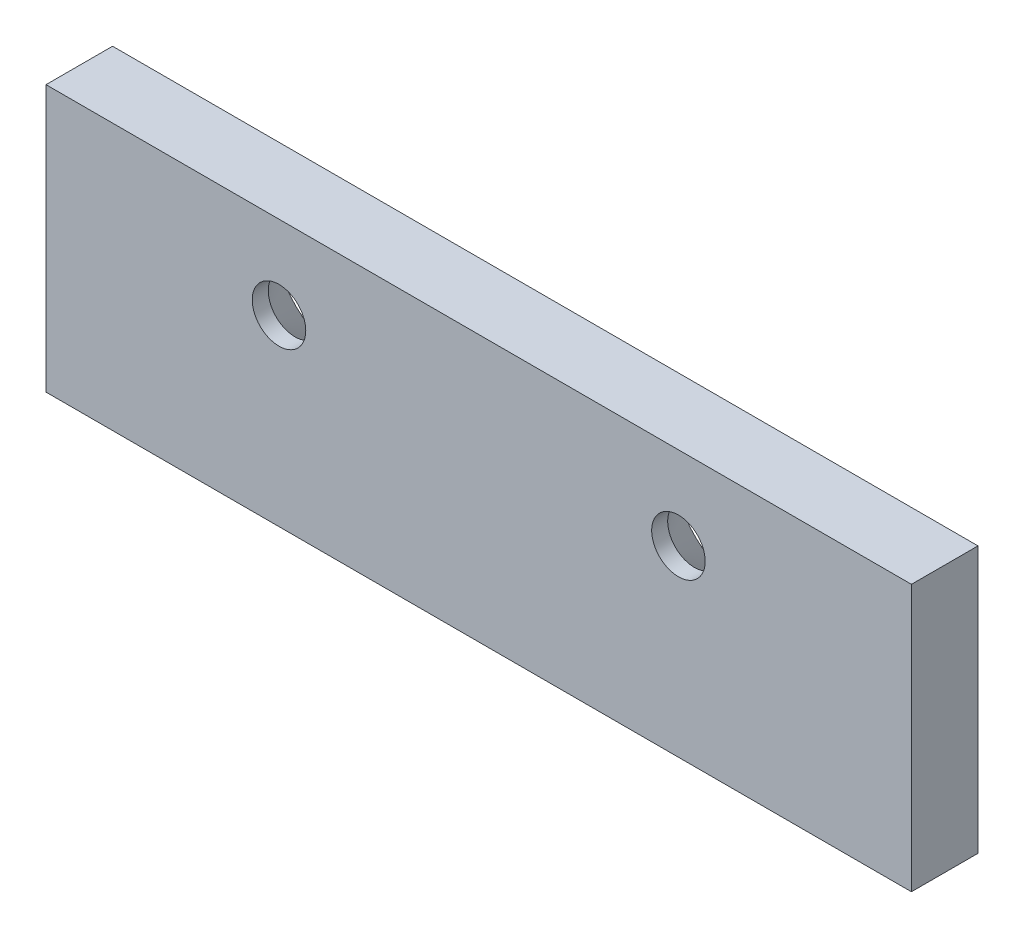
ISO-10303-21;
HEADER;
FILE_DESCRIPTION(('STEP AP214'),'2;1');
FILE_NAME('part.step','',(''),(''),'','','');
FILE_SCHEMA(('AUTOMOTIVE_DESIGN { 1 0 10303 214 1 1 1 1 }'));
ENDSEC;
DATA;
#1=APPLICATION_CONTEXT('core data for automotive mechanical design processes');
#2=APPLICATION_PROTOCOL_DEFINITION('international standard','automotive_design',2000,#1);
#3=PRODUCT_CONTEXT('',#1,'mechanical');
#4=PRODUCT('Part','Part','',(#3));
#5=PRODUCT_RELATED_PRODUCT_CATEGORY('part','',(#4));
#6=PRODUCT_DEFINITION_FORMATION('','',#4);
#7=PRODUCT_DEFINITION_CONTEXT('part definition',#1,'design');
#8=PRODUCT_DEFINITION('design','',#6,#7);
#9=PRODUCT_DEFINITION_SHAPE('','',#8);
#10=(LENGTH_UNIT() NAMED_UNIT(*) SI_UNIT(.MILLI.,.METRE.));
#11=(NAMED_UNIT(*) PLANE_ANGLE_UNIT() SI_UNIT($,.RADIAN.));
#12=(NAMED_UNIT(*) SI_UNIT($,.STERADIAN.) SOLID_ANGLE_UNIT());
#13=UNCERTAINTY_MEASURE_WITH_UNIT(LENGTH_MEASURE(1.E-05),#10,'distance_accuracy_value','');
#14=(GEOMETRIC_REPRESENTATION_CONTEXT(3) GLOBAL_UNCERTAINTY_ASSIGNED_CONTEXT((#13)) GLOBAL_UNIT_ASSIGNED_CONTEXT((#10,
#11,#12)) REPRESENTATION_CONTEXT('',''));
#15=CARTESIAN_POINT('',(0.,0.,0.));
#16=DIRECTION('',(0.,0.,1.));
#17=DIRECTION('',(1.,0.,0.));
#18=AXIS2_PLACEMENT_3D('',#15,#16,#17);
#19=CARTESIAN_POINT('',(0.,0.,-6.35));
#20=DIRECTION('',(-1.,0.,0.));
#21=DIRECTION('',(0.,0.,1.));
#22=AXIS2_PLACEMENT_3D('',#19,#20,#21);
#23=PLANE('',#22);
#24=DIRECTION('',(0.,-1.,0.));
#25=VECTOR('',#24,1.);
#26=CARTESIAN_POINT('',(0.,0.,0.));
#27=LINE('',#26,#25);
#28=CARTESIAN_POINT('',(0.,25.4,0.));
#29=VERTEX_POINT('',#28);
#30=CARTESIAN_POINT('',(0.,0.,0.));
#31=VERTEX_POINT('',#30);
#32=EDGE_CURVE('E101',#29,#31,#27,.T.);
#33=ORIENTED_EDGE('',*,*,#32,.F.);
#34=DIRECTION('',(0.,0.,1.));
#35=VECTOR('',#34,1.);
#36=CARTESIAN_POINT('',(0.,25.4,-6.35));
#37=LINE('',#36,#35);
#38=CARTESIAN_POINT('',(0.,25.4,-6.35));
#39=VERTEX_POINT('',#38);
#40=EDGE_CURVE('E11',#39,#29,#37,.T.);
#41=ORIENTED_EDGE('',*,*,#40,.F.);
#42=DIRECTION('',(0.,-1.,0.));
#43=VECTOR('',#42,1.);
#44=CARTESIAN_POINT('',(0.,0.,-6.35));
#45=LINE('',#44,#43);
#46=CARTESIAN_POINT('',(0.,0.,-6.35));
#47=VERTEX_POINT('',#46);
#48=EDGE_CURVE('E94',#39,#47,#45,.T.);
#49=ORIENTED_EDGE('',*,*,#48,.T.);
#50=DIRECTION('',(0.,0.,1.));
#51=VECTOR('',#50,1.);
#52=CARTESIAN_POINT('',(0.,0.,-6.35));
#53=LINE('',#52,#51);
#54=EDGE_CURVE('E39',#47,#31,#53,.T.);
#55=ORIENTED_EDGE('',*,*,#54,.T.);
#56=EDGE_LOOP('',(#33,#41,#49,#55));
#57=FACE_BOUND('',#56,.T.);
#58=ADVANCED_FACE('F36',(#57),#23,.T.);
#59=CARTESIAN_POINT('',(0.,25.4,-6.35));
#60=DIRECTION('',(0.,1.,0.));
#61=DIRECTION('',(0.,0.,1.));
#62=AXIS2_PLACEMENT_3D('',#59,#60,#61);
#63=PLANE('',#62);
#64=DIRECTION('',(-1.,0.,0.));
#65=VECTOR('',#64,1.);
#66=CARTESIAN_POINT('',(0.,25.4,0.));
#67=LINE('',#66,#65);
#68=CARTESIAN_POINT('',(82.55,25.4,0.));
#69=VERTEX_POINT('',#68);
#70=EDGE_CURVE('E96',#69,#29,#67,.T.);
#71=ORIENTED_EDGE('',*,*,#70,.F.);
#72=DIRECTION('',(0.,0.,1.));
#73=VECTOR('',#72,1.);
#74=CARTESIAN_POINT('',(82.55,25.4,-6.35));
#75=LINE('',#74,#73);
#76=CARTESIAN_POINT('',(82.55,25.4,-6.35));
#77=VERTEX_POINT('',#76);
#78=EDGE_CURVE('E45',#77,#69,#75,.T.);
#79=ORIENTED_EDGE('',*,*,#78,.F.);
#80=DIRECTION('',(-1.,0.,0.));
#81=VECTOR('',#80,1.);
#82=CARTESIAN_POINT('',(0.,25.4,-6.35));
#83=LINE('',#82,#81);
#84=EDGE_CURVE('E91',#77,#39,#83,.T.);
#85=ORIENTED_EDGE('',*,*,#84,.T.);
#86=ORIENTED_EDGE('',*,*,#40,.T.);
#87=EDGE_LOOP('',(#71,#79,#85,#86));
#88=FACE_BOUND('',#87,.T.);
#89=ADVANCED_FACE('F112',(#88),#63,.T.);
#90=CARTESIAN_POINT('',(82.55,0.,-6.35));
#91=DIRECTION('',(1.,0.,0.));
#92=DIRECTION('',(0.,0.,-1.));
#93=AXIS2_PLACEMENT_3D('',#90,#91,#92);
#94=PLANE('',#93);
#95=DIRECTION('',(0.,1.,0.));
#96=VECTOR('',#95,1.);
#97=CARTESIAN_POINT('',(82.55,0.,0.));
#98=LINE('',#97,#96);
#99=CARTESIAN_POINT('',(82.55,0.,0.));
#100=VERTEX_POINT('',#99);
#101=EDGE_CURVE('E86',#100,#69,#98,.T.);
#102=ORIENTED_EDGE('',*,*,#101,.F.);
#103=DIRECTION('',(0.,0.,1.));
#104=VECTOR('',#103,1.);
#105=CARTESIAN_POINT('',(82.55,0.,-6.35));
#106=LINE('',#105,#104);
#107=CARTESIAN_POINT('',(82.55,0.,-6.35));
#108=VERTEX_POINT('',#107);
#109=EDGE_CURVE('E81',#108,#100,#106,.T.);
#110=ORIENTED_EDGE('',*,*,#109,.F.);
#111=DIRECTION('',(0.,1.,0.));
#112=VECTOR('',#111,1.);
#113=CARTESIAN_POINT('',(82.55,0.,-6.35));
#114=LINE('',#113,#112);
#115=EDGE_CURVE('E84',#108,#77,#114,.T.);
#116=ORIENTED_EDGE('',*,*,#115,.T.);
#117=ORIENTED_EDGE('',*,*,#78,.T.);
#118=EDGE_LOOP('',(#102,#110,#116,#117));
#119=FACE_BOUND('',#118,.T.);
#120=ADVANCED_FACE('F83',(#119),#94,.T.);
#121=CARTESIAN_POINT('',(0.,0.,-6.35));
#122=DIRECTION('',(0.,-1.,0.));
#123=DIRECTION('',(0.,0.,-1.));
#124=AXIS2_PLACEMENT_3D('',#121,#122,#123);
#125=PLANE('',#124);
#126=DIRECTION('',(1.,0.,0.));
#127=VECTOR('',#126,1.);
#128=CARTESIAN_POINT('',(0.,0.,0.));
#129=LINE('',#128,#127);
#130=EDGE_CURVE('E104',#31,#100,#129,.T.);
#131=ORIENTED_EDGE('',*,*,#130,.F.);
#132=ORIENTED_EDGE('',*,*,#54,.F.);
#133=DIRECTION('',(1.,0.,0.));
#134=VECTOR('',#133,1.);
#135=CARTESIAN_POINT('',(0.,0.,-6.35));
#136=LINE('',#135,#134);
#137=EDGE_CURVE('E90',#47,#108,#136,.T.);
#138=ORIENTED_EDGE('',*,*,#137,.T.);
#139=ORIENTED_EDGE('',*,*,#109,.T.);
#140=EDGE_LOOP('',(#131,#132,#138,#139));
#141=FACE_BOUND('',#140,.T.);
#142=ADVANCED_FACE('F93',(#141),#125,.T.);
#143=CARTESIAN_POINT('',(0.,0.,-6.35));
#144=DIRECTION('',(0.,0.,-1.));
#145=DIRECTION('',(-1.,0.,0.));
#146=AXIS2_PLACEMENT_3D('',#143,#144,#145);
#147=PLANE('',#146);
#148=CARTESIAN_POINT('',(22.225,17.4625,-6.35));
#149=DIRECTION('',(0.,0.,1.));
#150=DIRECTION('',(1.,0.,0.));
#151=AXIS2_PLACEMENT_3D('',#148,#149,#150);
#152=CIRCLE('',#151,6.7437);
#153=CARTESIAN_POINT('',(28.9687,17.4625,-6.35));
#154=VERTEX_POINT('',#153);
#155=EDGE_CURVE('E158',#154,#154,#152,.T.);
#156=ORIENTED_EDGE('',*,*,#155,.T.);
#157=EDGE_LOOP('',(#156));
#158=FACE_BOUND('',#157,.T.);
#159=CARTESIAN_POINT('',(60.325,17.4625,-6.35));
#160=DIRECTION('',(0.,0.,1.));
#161=DIRECTION('',(1.,0.,0.));
#162=AXIS2_PLACEMENT_3D('',#159,#160,#161);
#163=CIRCLE('',#162,6.7437);
#164=CARTESIAN_POINT('',(67.0687,17.4625,-6.35));
#165=VERTEX_POINT('',#164);
#166=EDGE_CURVE('E160',#165,#165,#163,.T.);
#167=ORIENTED_EDGE('',*,*,#166,.T.);
#168=EDGE_LOOP('',(#167));
#169=FACE_BOUND('',#168,.T.);
#170=ORIENTED_EDGE('',*,*,#48,.F.);
#171=ORIENTED_EDGE('',*,*,#84,.F.);
#172=ORIENTED_EDGE('',*,*,#115,.F.);
#173=ORIENTED_EDGE('',*,*,#137,.F.);
#174=EDGE_LOOP('',(#170,#171,#172,#173));
#175=FACE_BOUND('',#174,.T.);
#176=ADVANCED_FACE('F89',(#158,#169,#175),#147,.T.);
#177=CARTESIAN_POINT('',(0.,0.,0.));
#178=DIRECTION('',(0.,0.,-1.));
#179=DIRECTION('',(-1.,0.,0.));
#180=AXIS2_PLACEMENT_3D('',#177,#178,#179);
#181=PLANE('',#180);
#182=CARTESIAN_POINT('',(22.225,17.4625,0.));
#183=DIRECTION('',(0.,0.,1.));
#184=DIRECTION('',(1.,0.,0.));
#185=AXIS2_PLACEMENT_3D('',#182,#183,#184);
#186=CIRCLE('',#185,2.55269999999999);
#187=CARTESIAN_POINT('',(24.7777,17.4625,0.));
#188=VERTEX_POINT('',#187);
#189=EDGE_CURVE('E157',#188,#188,#186,.T.);
#190=ORIENTED_EDGE('',*,*,#189,.F.);
#191=EDGE_LOOP('',(#190));
#192=FACE_BOUND('',#191,.T.);
#193=CARTESIAN_POINT('',(60.325,17.4625,0.));
#194=DIRECTION('',(0.,0.,1.));
#195=DIRECTION('',(1.,0.,0.));
#196=AXIS2_PLACEMENT_3D('',#193,#194,#195);
#197=CIRCLE('',#196,2.55269999999999);
#198=CARTESIAN_POINT('',(62.8777,17.4625,0.));
#199=VERTEX_POINT('',#198);
#200=EDGE_CURVE('E166',#199,#199,#197,.T.);
#201=ORIENTED_EDGE('',*,*,#200,.F.);
#202=EDGE_LOOP('',(#201));
#203=FACE_BOUND('',#202,.T.);
#204=ORIENTED_EDGE('',*,*,#32,.T.);
#205=ORIENTED_EDGE('',*,*,#130,.T.);
#206=ORIENTED_EDGE('',*,*,#101,.T.);
#207=ORIENTED_EDGE('',*,*,#70,.T.);
#208=EDGE_LOOP('',(#204,#205,#206,#207));
#209=FACE_BOUND('',#208,.T.);
#210=ADVANCED_FACE('F111',(#192,#203,#209),#181,.F.);
#211=CARTESIAN_POINT('',(60.325,17.4625,-1.52880600533674));
#212=DIRECTION('',(0.,0.,-1.));
#213=DIRECTION('',(-1.,0.,0.));
#214=AXIS2_PLACEMENT_3D('',#211,#212,#213);
#215=CONICAL_SURFACE('',#214,2.55270000000001,0.715584993317675);
#216=ORIENTED_EDGE('',*,*,#166,.F.);
#217=EDGE_LOOP('',(#216));
#218=FACE_BOUND('',#217,.T.);
#219=CARTESIAN_POINT('',(60.325,17.4625,-1.52880600533674));
#220=DIRECTION('',(0.,0.,1.));
#221=DIRECTION('',(1.,0.,0.));
#222=AXIS2_PLACEMENT_3D('',#219,#220,#221);
#223=CIRCLE('',#222,2.55270000000001);
#224=CARTESIAN_POINT('',(62.8777,17.4625,-1.52880600533674));
#225=VERTEX_POINT('',#224);
#226=EDGE_CURVE('E105',#225,#225,#223,.T.);
#227=ORIENTED_EDGE('',*,*,#226,.T.);
#228=EDGE_LOOP('',(#227));
#229=FACE_BOUND('',#228,.T.);
#230=ADVANCED_FACE('F130',(#218,#229),#215,.F.);
#231=CARTESIAN_POINT('',(60.325,17.4625,0.));
#232=DIRECTION('',(0.,0.,1.));
#233=DIRECTION('',(1.,0.,0.));
#234=AXIS2_PLACEMENT_3D('',#231,#232,#233);
#235=CYLINDRICAL_SURFACE('',#234,2.5527);
#236=ORIENTED_EDGE('',*,*,#226,.F.);
#237=EDGE_LOOP('',(#236));
#238=FACE_BOUND('',#237,.T.);
#239=ORIENTED_EDGE('',*,*,#200,.T.);
#240=EDGE_LOOP('',(#239));
#241=FACE_BOUND('',#240,.T.);
#242=ADVANCED_FACE('F137',(#238,#241),#235,.F.);
#243=CARTESIAN_POINT('',(22.225,17.4625,-1.52880600533674));
#244=DIRECTION('',(0.,0.,-1.));
#245=DIRECTION('',(-1.,0.,0.));
#246=AXIS2_PLACEMENT_3D('',#243,#244,#245);
#247=CONICAL_SURFACE('',#246,2.5527,0.715584993317675);
#248=ORIENTED_EDGE('',*,*,#155,.F.);
#249=EDGE_LOOP('',(#248));
#250=FACE_BOUND('',#249,.T.);
#251=CARTESIAN_POINT('',(22.225,17.4625,-1.52880600533674));
#252=DIRECTION('',(0.,0.,1.));
#253=DIRECTION('',(1.,0.,0.));
#254=AXIS2_PLACEMENT_3D('',#251,#252,#253);
#255=CIRCLE('',#254,2.5527);
#256=CARTESIAN_POINT('',(24.7777,17.4625,-1.52880600533674));
#257=VERTEX_POINT('',#256);
#258=EDGE_CURVE('E154',#257,#257,#255,.T.);
#259=ORIENTED_EDGE('',*,*,#258,.T.);
#260=EDGE_LOOP('',(#259));
#261=FACE_BOUND('',#260,.T.);
#262=ADVANCED_FACE('F141',(#250,#261),#247,.F.);
#263=CARTESIAN_POINT('',(22.225,17.4625,0.));
#264=DIRECTION('',(0.,0.,1.));
#265=DIRECTION('',(1.,0.,0.));
#266=AXIS2_PLACEMENT_3D('',#263,#264,#265);
#267=CYLINDRICAL_SURFACE('',#266,2.55269999999999);
#268=ORIENTED_EDGE('',*,*,#258,.F.);
#269=EDGE_LOOP('',(#268));
#270=FACE_BOUND('',#269,.T.);
#271=ORIENTED_EDGE('',*,*,#189,.T.);
#272=EDGE_LOOP('',(#271));
#273=FACE_BOUND('',#272,.T.);
#274=ADVANCED_FACE('F145',(#270,#273),#267,.F.);
#275=CLOSED_SHELL('',(#58,#89,#120,#142,#176,#210,#230,#242,#262,#274));
#276=MANIFOLD_SOLID_BREP('B2',#275);
#277=ADVANCED_BREP_SHAPE_REPRESENTATION('',(#18,#276),#14);
#278=SHAPE_DEFINITION_REPRESENTATION(#9,#277);
ENDSEC;
END-ISO-10303-21;
